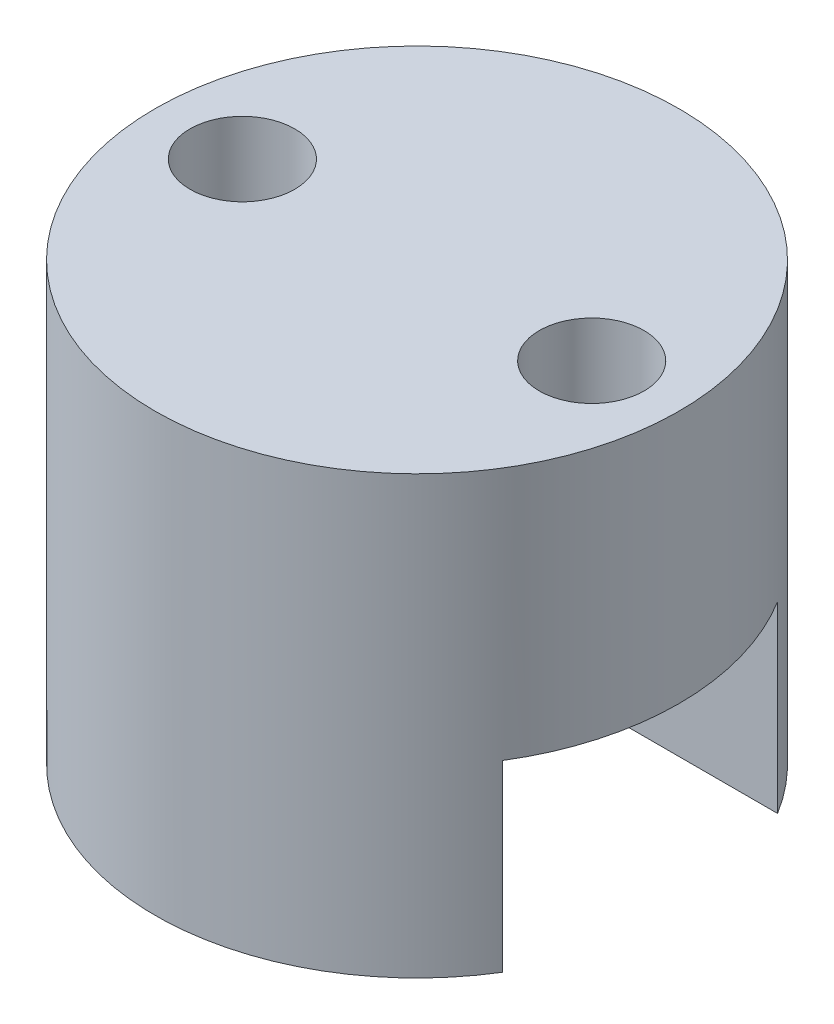
ISO-10303-21;
HEADER;
FILE_DESCRIPTION(('STEP AP214'),'2;1');
FILE_NAME('part.step','',(''),(''),'','','');
FILE_SCHEMA(('AUTOMOTIVE_DESIGN { 1 0 10303 214 1 1 1 1 }'));
ENDSEC;
DATA;
#1=APPLICATION_CONTEXT('core data for automotive mechanical design processes');
#2=APPLICATION_PROTOCOL_DEFINITION('international standard','automotive_design',2000,#1);
#3=PRODUCT_CONTEXT('',#1,'mechanical');
#4=PRODUCT('Part','Part','',(#3));
#5=PRODUCT_RELATED_PRODUCT_CATEGORY('part','',(#4));
#6=PRODUCT_DEFINITION_FORMATION('','',#4);
#7=PRODUCT_DEFINITION_CONTEXT('part definition',#1,'design');
#8=PRODUCT_DEFINITION('design','',#6,#7);
#9=PRODUCT_DEFINITION_SHAPE('','',#8);
#10=(LENGTH_UNIT() NAMED_UNIT(*) SI_UNIT(.MILLI.,.METRE.));
#11=(NAMED_UNIT(*) PLANE_ANGLE_UNIT() SI_UNIT($,.RADIAN.));
#12=(NAMED_UNIT(*) SI_UNIT($,.STERADIAN.) SOLID_ANGLE_UNIT());
#13=UNCERTAINTY_MEASURE_WITH_UNIT(LENGTH_MEASURE(1.E-05),#10,'distance_accuracy_value','');
#14=(GEOMETRIC_REPRESENTATION_CONTEXT(3) GLOBAL_UNCERTAINTY_ASSIGNED_CONTEXT((#13)) GLOBAL_UNIT_ASSIGNED_CONTEXT((#10,
#11,#12)) REPRESENTATION_CONTEXT('',''));
#15=CARTESIAN_POINT('',(0.,0.,0.));
#16=DIRECTION('',(0.,0.,1.));
#17=DIRECTION('',(1.,0.,0.));
#18=AXIS2_PLACEMENT_3D('',#15,#16,#17);
#19=CARTESIAN_POINT('',(0.,0.,0.));
#20=DIRECTION('',(0.,1.,0.));
#21=DIRECTION('',(0.,0.,1.));
#22=AXIS2_PLACEMENT_3D('',#19,#20,#21);
#23=PLANE('',#22);
#24=CARTESIAN_POINT('',(0.,0.,0.));
#25=DIRECTION('',(0.,1.,0.));
#26=DIRECTION('',(0.,0.,1.));
#27=AXIS2_PLACEMENT_3D('',#24,#25,#26);
#28=CIRCLE('',#27,6.);
#29=CARTESIAN_POINT('',(-5.10661335916476,0.,3.15));
#30=VERTEX_POINT('',#29);
#31=CARTESIAN_POINT('',(5.10661335916476,0.,3.15));
#32=VERTEX_POINT('',#31);
#33=EDGE_CURVE('E39',#30,#32,#28,.T.);
#34=ORIENTED_EDGE('',*,*,#33,.F.);
#35=DIRECTION('',(-1.,0.,0.));
#36=VECTOR('',#35,1.);
#37=CARTESIAN_POINT('',(-5.10661335916476,0.,3.15));
#38=LINE('',#37,#36);
#39=EDGE_CURVE('E74',#32,#30,#38,.T.);
#40=ORIENTED_EDGE('',*,*,#39,.F.);
#41=EDGE_LOOP('',(#34,#40));
#42=FACE_BOUND('',#41,.T.);
#43=ADVANCED_FACE('F35',(#42),#23,.F.);
#44=CARTESIAN_POINT('',(0.,10.,0.));
#45=DIRECTION('',(0.,-1.,0.));
#46=DIRECTION('',(0.,0.,-1.));
#47=AXIS2_PLACEMENT_3D('',#44,#45,#46);
#48=CYLINDRICAL_SURFACE('',#47,6.);
#49=ORIENTED_EDGE('',*,*,#33,.T.);
#50=DIRECTION('',(0.,-1.,0.));
#51=VECTOR('',#50,1.);
#52=CARTESIAN_POINT('',(5.10661335916476,4.2,3.15));
#53=LINE('',#52,#51);
#54=CARTESIAN_POINT('',(5.10661335916476,4.2,3.15));
#55=VERTEX_POINT('',#54);
#56=EDGE_CURVE('E88',#55,#32,#53,.T.);
#57=ORIENTED_EDGE('',*,*,#56,.F.);
#58=CARTESIAN_POINT('',(0.,4.2,0.));
#59=DIRECTION('',(0.,-1.,0.));
#60=DIRECTION('',(0.,0.,-1.));
#61=AXIS2_PLACEMENT_3D('',#58,#59,#60);
#62=CIRCLE('',#61,6.);
#63=CARTESIAN_POINT('',(5.10661335916476,4.2,-3.15));
#64=VERTEX_POINT('',#63);
#65=EDGE_CURVE('E92',#64,#55,#62,.T.);
#66=ORIENTED_EDGE('',*,*,#65,.F.);
#67=DIRECTION('',(0.,-1.,0.));
#68=VECTOR('',#67,1.);
#69=CARTESIAN_POINT('',(5.10661335916476,4.2,-3.15));
#70=LINE('',#69,#68);
#71=CARTESIAN_POINT('',(5.10661335916476,0.,-3.15));
#72=VERTEX_POINT('',#71);
#73=EDGE_CURVE('E81',#64,#72,#70,.T.);
#74=ORIENTED_EDGE('',*,*,#73,.T.);
#75=CARTESIAN_POINT('',(-5.10661335916476,0.,-3.15));
#76=VERTEX_POINT('',#75);
#77=EDGE_CURVE('E44',#72,#76,#28,.T.);
#78=ORIENTED_EDGE('',*,*,#77,.T.);
#79=DIRECTION('',(0.,-1.,0.));
#80=VECTOR('',#79,1.);
#81=CARTESIAN_POINT('',(-5.10661335916476,4.2,-3.15));
#82=LINE('',#81,#80);
#83=CARTESIAN_POINT('',(-5.10661335916476,4.2,-3.15));
#84=VERTEX_POINT('',#83);
#85=EDGE_CURVE('E51',#84,#76,#82,.T.);
#86=ORIENTED_EDGE('',*,*,#85,.F.);
#87=CARTESIAN_POINT('',(0.,4.2,0.));
#88=DIRECTION('',(0.,-1.,0.));
#89=DIRECTION('',(0.,0.,-1.));
#90=AXIS2_PLACEMENT_3D('',#87,#88,#89);
#91=CIRCLE('',#90,6.);
#92=CARTESIAN_POINT('',(-5.10661335916476,4.2,3.15));
#93=VERTEX_POINT('',#92);
#94=EDGE_CURVE('E94',#93,#84,#91,.T.);
#95=ORIENTED_EDGE('',*,*,#94,.F.);
#96=DIRECTION('',(0.,-1.,0.));
#97=VECTOR('',#96,1.);
#98=CARTESIAN_POINT('',(-5.10661335916476,4.2,3.15));
#99=LINE('',#98,#97);
#100=EDGE_CURVE('E60',#93,#30,#99,.T.);
#101=ORIENTED_EDGE('',*,*,#100,.T.);
#102=EDGE_LOOP('',(#49,#57,#66,#74,#78,#86,#95,#101));
#103=FACE_BOUND('',#102,.T.);
#104=CARTESIAN_POINT('',(0.,10.,0.));
#105=DIRECTION('',(0.,1.,0.));
#106=DIRECTION('',(0.,0.,1.));
#107=AXIS2_PLACEMENT_3D('',#104,#105,#106);
#108=CIRCLE('',#107,6.);
#109=CARTESIAN_POINT('',(0.,10.,6.));
#110=VERTEX_POINT('',#109);
#111=EDGE_CURVE('E11',#110,#110,#108,.T.);
#112=ORIENTED_EDGE('',*,*,#111,.F.);
#113=EDGE_LOOP('',(#112));
#114=FACE_BOUND('',#113,.T.);
#115=ADVANCED_FACE('F37',(#103,#114),#48,.T.);
#116=CARTESIAN_POINT('',(0.,10.,0.));
#117=DIRECTION('',(0.,1.,0.));
#118=DIRECTION('',(0.,0.,1.));
#119=AXIS2_PLACEMENT_3D('',#116,#117,#118);
#120=PLANE('',#119);
#121=CARTESIAN_POINT('',(-4.,10.,0.));
#122=DIRECTION('',(0.,1.,0.));
#123=DIRECTION('',(0.,0.,1.));
#124=AXIS2_PLACEMENT_3D('',#121,#122,#123);
#125=CIRCLE('',#124,1.2);
#126=CARTESIAN_POINT('',(-4.,10.,1.2));
#127=VERTEX_POINT('',#126);
#128=EDGE_CURVE('E217',#127,#127,#125,.F.);
#129=ORIENTED_EDGE('',*,*,#128,.T.);
#130=EDGE_LOOP('',(#129));
#131=FACE_BOUND('',#130,.T.);
#132=CARTESIAN_POINT('',(4.,10.,0.));
#133=DIRECTION('',(0.,1.,0.));
#134=DIRECTION('',(0.,0.,1.));
#135=AXIS2_PLACEMENT_3D('',#132,#133,#134);
#136=CIRCLE('',#135,1.2);
#137=CARTESIAN_POINT('',(4.,10.,1.2));
#138=VERTEX_POINT('',#137);
#139=EDGE_CURVE('E224',#138,#138,#136,.F.);
#140=ORIENTED_EDGE('',*,*,#139,.T.);
#141=EDGE_LOOP('',(#140));
#142=FACE_BOUND('',#141,.T.);
#143=ORIENTED_EDGE('',*,*,#111,.T.);
#144=EDGE_LOOP('',(#143));
#145=FACE_BOUND('',#144,.T.);
#146=ADVANCED_FACE('F115',(#131,#142,#145),#120,.T.);
#147=ORIENTED_EDGE('',*,*,#77,.F.);
#148=DIRECTION('',(1.,0.,0.));
#149=VECTOR('',#148,1.);
#150=CARTESIAN_POINT('',(-5.10661335916476,0.,-3.15));
#151=LINE('',#150,#149);
#152=EDGE_CURVE('E83',#76,#72,#151,.T.);
#153=ORIENTED_EDGE('',*,*,#152,.F.);
#154=EDGE_LOOP('',(#147,#153));
#155=FACE_BOUND('',#154,.T.);
#156=ADVANCED_FACE('F113',(#155),#23,.F.);
#157=CARTESIAN_POINT('',(-5.10661335916476,4.2,3.15));
#158=DIRECTION('',(0.,0.,1.));
#159=DIRECTION('',(1.,0.,0.));
#160=AXIS2_PLACEMENT_3D('',#157,#158,#159);
#161=PLANE('',#160);
#162=ORIENTED_EDGE('',*,*,#39,.T.);
#163=ORIENTED_EDGE('',*,*,#100,.F.);
#164=DIRECTION('',(-1.,0.,0.));
#165=VECTOR('',#164,1.);
#166=CARTESIAN_POINT('',(-5.10661335916476,4.2,3.15));
#167=LINE('',#166,#165);
#168=EDGE_CURVE('E99',#55,#93,#167,.T.);
#169=ORIENTED_EDGE('',*,*,#168,.F.);
#170=ORIENTED_EDGE('',*,*,#56,.T.);
#171=EDGE_LOOP('',(#162,#163,#169,#170));
#172=FACE_BOUND('',#171,.T.);
#173=ADVANCED_FACE('F109',(#172),#161,.F.);
#174=CARTESIAN_POINT('',(-5.10661335916476,4.2,-3.15));
#175=DIRECTION('',(0.,0.,-1.));
#176=DIRECTION('',(-1.,0.,0.));
#177=AXIS2_PLACEMENT_3D('',#174,#175,#176);
#178=PLANE('',#177);
#179=ORIENTED_EDGE('',*,*,#152,.T.);
#180=ORIENTED_EDGE('',*,*,#73,.F.);
#181=DIRECTION('',(1.,0.,0.));
#182=VECTOR('',#181,1.);
#183=CARTESIAN_POINT('',(-5.10661335916476,4.2,-3.15));
#184=LINE('',#183,#182);
#185=EDGE_CURVE('E78',#84,#64,#184,.T.);
#186=ORIENTED_EDGE('',*,*,#185,.F.);
#187=ORIENTED_EDGE('',*,*,#85,.T.);
#188=EDGE_LOOP('',(#179,#180,#186,#187));
#189=FACE_BOUND('',#188,.T.);
#190=ADVANCED_FACE('F82',(#189),#178,.F.);
#191=CARTESIAN_POINT('',(0.,4.2,0.));
#192=DIRECTION('',(0.,-1.,0.));
#193=DIRECTION('',(0.,0.,-1.));
#194=AXIS2_PLACEMENT_3D('',#191,#192,#193);
#195=PLANE('',#194);
#196=CARTESIAN_POINT('',(-4.,4.2,0.));
#197=DIRECTION('',(0.,-1.,0.));
#198=DIRECTION('',(0.,0.,-1.));
#199=AXIS2_PLACEMENT_3D('',#196,#197,#198);
#200=CIRCLE('',#199,1.2);
#201=CARTESIAN_POINT('',(-4.,4.2,-1.2));
#202=VERTEX_POINT('',#201);
#203=EDGE_CURVE('E221',#202,#202,#200,.T.);
#204=ORIENTED_EDGE('',*,*,#203,.F.);
#205=EDGE_LOOP('',(#204));
#206=FACE_BOUND('',#205,.T.);
#207=CARTESIAN_POINT('',(4.,4.2,0.));
#208=DIRECTION('',(0.,-1.,0.));
#209=DIRECTION('',(0.,0.,1.));
#210=AXIS2_PLACEMENT_3D('',#207,#208,#209);
#211=CIRCLE('',#210,1.2);
#212=CARTESIAN_POINT('',(4.,4.2,1.2));
#213=VERTEX_POINT('',#212);
#214=EDGE_CURVE('E227',#213,#213,#211,.T.);
#215=ORIENTED_EDGE('',*,*,#214,.F.);
#216=EDGE_LOOP('',(#215));
#217=FACE_BOUND('',#216,.T.);
#218=CARTESIAN_POINT('',(0.,4.2,0.));
#219=DIRECTION('',(0.,-1.,0.));
#220=DIRECTION('',(0.,0.,-1.));
#221=AXIS2_PLACEMENT_3D('',#218,#219,#220);
#222=CIRCLE('',#221,1.75);
#223=CARTESIAN_POINT('',(0.,4.2,-1.75));
#224=VERTEX_POINT('',#223);
#225=EDGE_CURVE('E215',#224,#224,#222,.T.);
#226=ORIENTED_EDGE('',*,*,#225,.F.);
#227=EDGE_LOOP('',(#226));
#228=FACE_BOUND('',#227,.T.);
#229=ORIENTED_EDGE('',*,*,#94,.T.);
#230=ORIENTED_EDGE('',*,*,#185,.T.);
#231=ORIENTED_EDGE('',*,*,#65,.T.);
#232=ORIENTED_EDGE('',*,*,#168,.T.);
#233=EDGE_LOOP('',(#229,#230,#231,#232));
#234=FACE_BOUND('',#233,.T.);
#235=ADVANCED_FACE('F91',(#206,#217,#228,#234),#195,.T.);
#236=CARTESIAN_POINT('',(0.,9.7,0.));
#237=DIRECTION('',(0.,-1.,0.));
#238=DIRECTION('',(0.,0.,-1.));
#239=AXIS2_PLACEMENT_3D('',#236,#237,#238);
#240=CYLINDRICAL_SURFACE('',#239,1.75);
#241=CARTESIAN_POINT('',(0.,9.7,0.));
#242=DIRECTION('',(0.,-1.,0.));
#243=DIRECTION('',(0.,0.,-1.));
#244=AXIS2_PLACEMENT_3D('',#241,#242,#243);
#245=CIRCLE('',#244,1.75);
#246=CARTESIAN_POINT('',(0.,9.7,-1.75));
#247=VERTEX_POINT('',#246);
#248=EDGE_CURVE('E105',#247,#247,#245,.T.);
#249=ORIENTED_EDGE('',*,*,#248,.F.);
#250=EDGE_LOOP('',(#249));
#251=FACE_BOUND('',#250,.T.);
#252=ORIENTED_EDGE('',*,*,#225,.T.);
#253=EDGE_LOOP('',(#252));
#254=FACE_BOUND('',#253,.T.);
#255=ADVANCED_FACE('F148',(#251,#254),#240,.F.);
#256=CARTESIAN_POINT('',(0.,9.7,0.));
#257=DIRECTION('',(0.,-1.,0.));
#258=DIRECTION('',(0.,0.,-1.));
#259=AXIS2_PLACEMENT_3D('',#256,#257,#258);
#260=PLANE('',#259);
#261=ORIENTED_EDGE('',*,*,#248,.T.);
#262=EDGE_LOOP('',(#261));
#263=FACE_BOUND('',#262,.T.);
#264=ADVANCED_FACE('F140',(#263),#260,.T.);
#265=CARTESIAN_POINT('',(4.,13.3941125496954,0.));
#266=DIRECTION('',(0.,-1.,0.));
#267=DIRECTION('',(0.,0.,-1.));
#268=AXIS2_PLACEMENT_3D('',#265,#266,#267);
#269=CYLINDRICAL_SURFACE('',#268,1.2);
#270=ORIENTED_EDGE('',*,*,#214,.T.);
#271=EDGE_LOOP('',(#270));
#272=FACE_BOUND('',#271,.T.);
#273=ORIENTED_EDGE('',*,*,#139,.F.);
#274=EDGE_LOOP('',(#273));
#275=FACE_BOUND('',#274,.T.);
#276=ADVANCED_FACE('F155',(#272,#275),#269,.F.);
#277=CARTESIAN_POINT('',(-4.,13.3941125496954,0.));
#278=DIRECTION('',(0.,-1.,0.));
#279=DIRECTION('',(0.,0.,-1.));
#280=AXIS2_PLACEMENT_3D('',#277,#278,#279);
#281=CYLINDRICAL_SURFACE('',#280,1.2);
#282=ORIENTED_EDGE('',*,*,#203,.T.);
#283=EDGE_LOOP('',(#282));
#284=FACE_BOUND('',#283,.T.);
#285=ORIENTED_EDGE('',*,*,#128,.F.);
#286=EDGE_LOOP('',(#285));
#287=FACE_BOUND('',#286,.T.);
#288=ADVANCED_FACE('F160',(#284,#287),#281,.F.);
#289=CLOSED_SHELL('',(#43,#115,#146,#156,#173,#190,#235,#255,#264,#276,#288));
#290=MANIFOLD_SOLID_BREP('B2',#289);
#291=ADVANCED_BREP_SHAPE_REPRESENTATION('',(#18,#290),#14);
#292=SHAPE_DEFINITION_REPRESENTATION(#9,#291);
ENDSEC;
END-ISO-10303-21;
